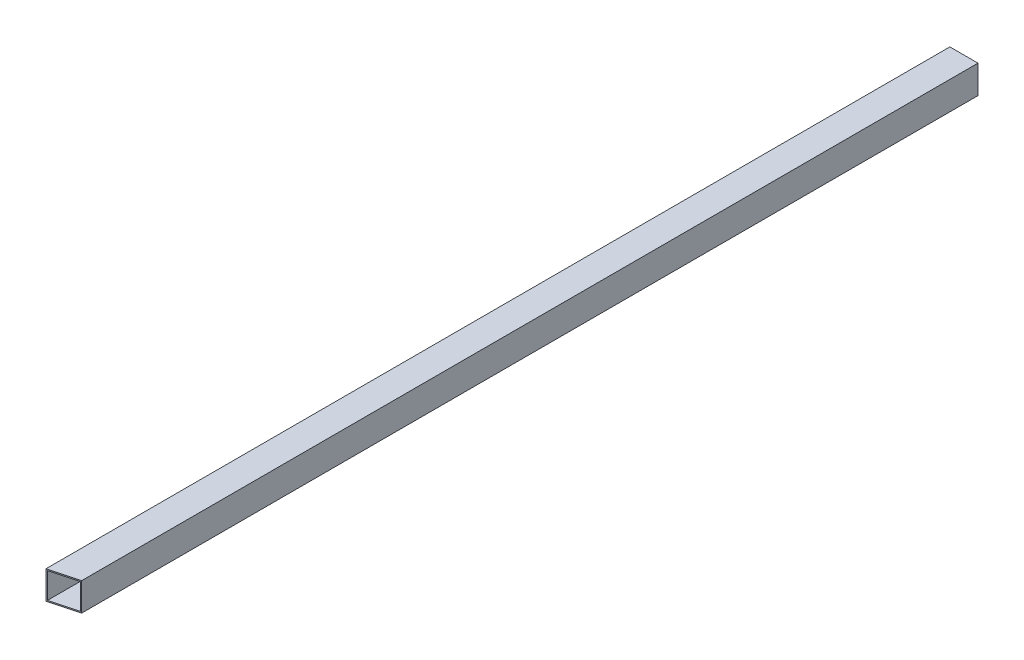
ISO-10303-21;
HEADER;
FILE_DESCRIPTION(('STEP AP214'),'2;1');
FILE_NAME('part.step','',(''),(''),'','','');
FILE_SCHEMA(('AUTOMOTIVE_DESIGN { 1 0 10303 214 1 1 1 1 }'));
ENDSEC;
DATA;
#1=APPLICATION_CONTEXT('core data for automotive mechanical design processes');
#2=APPLICATION_PROTOCOL_DEFINITION('international standard','automotive_design',2000,#1);
#3=PRODUCT_CONTEXT('',#1,'mechanical');
#4=PRODUCT('Part','Part','',(#3));
#5=PRODUCT_RELATED_PRODUCT_CATEGORY('part','',(#4));
#6=PRODUCT_DEFINITION_FORMATION('','',#4);
#7=PRODUCT_DEFINITION_CONTEXT('part definition',#1,'design');
#8=PRODUCT_DEFINITION('design','',#6,#7);
#9=PRODUCT_DEFINITION_SHAPE('','',#8);
#10=(LENGTH_UNIT() NAMED_UNIT(*) SI_UNIT(.MILLI.,.METRE.));
#11=(NAMED_UNIT(*) PLANE_ANGLE_UNIT() SI_UNIT($,.RADIAN.));
#12=(NAMED_UNIT(*) SI_UNIT($,.STERADIAN.) SOLID_ANGLE_UNIT());
#13=UNCERTAINTY_MEASURE_WITH_UNIT(LENGTH_MEASURE(1.E-05),#10,'distance_accuracy_value','');
#14=(GEOMETRIC_REPRESENTATION_CONTEXT(3) GLOBAL_UNCERTAINTY_ASSIGNED_CONTEXT((#13)) GLOBAL_UNIT_ASSIGNED_CONTEXT((#10,
#11,#12)) REPRESENTATION_CONTEXT('',''));
#15=CARTESIAN_POINT('',(0.,0.,0.));
#16=DIRECTION('',(0.,0.,1.));
#17=DIRECTION('',(1.,0.,0.));
#18=AXIS2_PLACEMENT_3D('',#15,#16,#17);
#19=CARTESIAN_POINT('',(-1454.,1675.,10.));
#20=DIRECTION('',(0.,1.,0.));
#21=DIRECTION('',(1.,0.,0.));
#22=AXIS2_PLACEMENT_3D('',#19,#20,#21);
#23=PLANE('',#22);
#24=DIRECTION('',(0.,0.,1.));
#25=VECTOR('',#24,1.);
#26=CARTESIAN_POINT('',(-1454.,1675.,10.));
#27=LINE('',#26,#25);
#28=CARTESIAN_POINT('',(-1454.,1675.,10.));
#29=VERTEX_POINT('',#28);
#30=CARTESIAN_POINT('',(-1454.,1675.,3195.310257359));
#31=VERTEX_POINT('',#30);
#32=EDGE_CURVE('E11',#29,#31,#27,.T.);
#33=ORIENTED_EDGE('',*,*,#32,.F.);
#34=DIRECTION('',(-1.,0.,0.));
#35=VECTOR('',#34,1.);
#36=CARTESIAN_POINT('',(-1454.,1675.,10.));
#37=LINE('',#36,#35);
#38=CARTESIAN_POINT('',(-1546.,1675.,10.));
#39=VERTEX_POINT('',#38);
#40=EDGE_CURVE('E184',#29,#39,#37,.T.);
#41=ORIENTED_EDGE('',*,*,#40,.T.);
#42=DIRECTION('',(0.,0.,1.));
#43=VECTOR('',#42,1.);
#44=CARTESIAN_POINT('',(-1546.,1675.,10.));
#45=LINE('',#44,#43);
#46=CARTESIAN_POINT('',(-1546.,1675.,3219.961583063));
#47=VERTEX_POINT('',#46);
#48=EDGE_CURVE('E142',#39,#47,#45,.T.);
#49=ORIENTED_EDGE('',*,*,#48,.T.);
#50=DIRECTION('',(-0.965925826288944,0.,0.258819045102985));
#51=VECTOR('',#50,1.);
#52=CARTESIAN_POINT('',(-352.776979502,1675.,2900.23843833));
#53=LINE('',#52,#51);
#54=EDGE_CURVE('E158',#31,#47,#53,.T.);
#55=ORIENTED_EDGE('',*,*,#54,.F.);
#56=EDGE_LOOP('',(#33,#41,#49,#55));
#57=FACE_BOUND('',#56,.T.);
#58=ADVANCED_FACE('F17',(#57),#23,.T.);
#59=CARTESIAN_POINT('',(-1454.,1767.,10.));
#60=DIRECTION('',(-1.,0.,0.));
#61=DIRECTION('',(0.,0.,1.));
#62=AXIS2_PLACEMENT_3D('',#59,#60,#61);
#63=PLANE('',#62);
#64=DIRECTION('',(0.,0.,1.));
#65=VECTOR('',#64,1.);
#66=CARTESIAN_POINT('',(-1454.,1767.,10.));
#67=LINE('',#66,#65);
#68=CARTESIAN_POINT('',(-1454.,1767.,10.));
#69=VERTEX_POINT('',#68);
#70=CARTESIAN_POINT('',(-1454.,1767.,3195.310257359));
#71=VERTEX_POINT('',#70);
#72=EDGE_CURVE('E25',#69,#71,#67,.T.);
#73=ORIENTED_EDGE('',*,*,#72,.F.);
#74=DIRECTION('',(0.,-1.,0.));
#75=VECTOR('',#74,1.);
#76=CARTESIAN_POINT('',(-1454.,1767.,10.));
#77=LINE('',#76,#75);
#78=EDGE_CURVE('E143',#69,#29,#77,.T.);
#79=ORIENTED_EDGE('',*,*,#78,.T.);
#80=ORIENTED_EDGE('',*,*,#32,.T.);
#81=DIRECTION('',(0.,-1.,0.));
#82=VECTOR('',#81,1.);
#83=CARTESIAN_POINT('',(-1454.,883.5,3195.310257359));
#84=LINE('',#83,#82);
#85=EDGE_CURVE('E151',#71,#31,#84,.T.);
#86=ORIENTED_EDGE('',*,*,#85,.F.);
#87=EDGE_LOOP('',(#73,#79,#80,#86));
#88=FACE_BOUND('',#87,.T.);
#89=ADVANCED_FACE('F197',(#88),#63,.T.);
#90=CARTESIAN_POINT('',(-1546.,1767.,10.));
#91=DIRECTION('',(0.,-1.,0.));
#92=DIRECTION('',(0.,0.,-1.));
#93=AXIS2_PLACEMENT_3D('',#90,#91,#92);
#94=PLANE('',#93);
#95=DIRECTION('',(0.,0.,1.));
#96=VECTOR('',#95,1.);
#97=CARTESIAN_POINT('',(-1546.,1767.,10.));
#98=LINE('',#97,#96);
#99=CARTESIAN_POINT('',(-1546.,1767.,10.));
#100=VERTEX_POINT('',#99);
#101=CARTESIAN_POINT('',(-1546.,1767.,3219.961583063));
#102=VERTEX_POINT('',#101);
#103=EDGE_CURVE('E177',#100,#102,#98,.T.);
#104=ORIENTED_EDGE('',*,*,#103,.F.);
#105=DIRECTION('',(1.,0.,0.));
#106=VECTOR('',#105,1.);
#107=CARTESIAN_POINT('',(-1546.,1767.,10.));
#108=LINE('',#107,#106);
#109=EDGE_CURVE('E140',#100,#69,#108,.T.);
#110=ORIENTED_EDGE('',*,*,#109,.T.);
#111=ORIENTED_EDGE('',*,*,#72,.T.);
#112=DIRECTION('',(0.965925826288944,0.,-0.258819045102985));
#113=VECTOR('',#112,1.);
#114=CARTESIAN_POINT('',(-395.6955637891,1767.,2911.73843833));
#115=LINE('',#114,#113);
#116=EDGE_CURVE('E147',#102,#71,#115,.T.);
#117=ORIENTED_EDGE('',*,*,#116,.F.);
#118=EDGE_LOOP('',(#104,#110,#111,#117));
#119=FACE_BOUND('',#118,.T.);
#120=ADVANCED_FACE('F194',(#119),#94,.T.);
#121=CARTESIAN_POINT('',(-1546.,1675.,10.));
#122=DIRECTION('',(1.,0.,0.));
#123=DIRECTION('',(0.,1.,0.));
#124=AXIS2_PLACEMENT_3D('',#121,#122,#123);
#125=PLANE('',#124);
#126=ORIENTED_EDGE('',*,*,#48,.F.);
#127=DIRECTION('',(0.,1.,0.));
#128=VECTOR('',#127,1.);
#129=CARTESIAN_POINT('',(-1546.,1675.,10.));
#130=LINE('',#129,#128);
#131=EDGE_CURVE('E180',#39,#100,#130,.T.);
#132=ORIENTED_EDGE('',*,*,#131,.T.);
#133=ORIENTED_EDGE('',*,*,#103,.T.);
#134=DIRECTION('',(0.,1.,0.));
#135=VECTOR('',#134,1.);
#136=CARTESIAN_POINT('',(-1546.,837.5,3219.961583063));
#137=LINE('',#136,#135);
#138=EDGE_CURVE('E162',#47,#102,#137,.T.);
#139=ORIENTED_EDGE('',*,*,#138,.F.);
#140=EDGE_LOOP('',(#126,#132,#133,#139));
#141=FACE_BOUND('',#140,.T.);
#142=ADVANCED_FACE('F203',(#141),#125,.T.);
#143=CARTESIAN_POINT('',(-1450.,1671.,10.));
#144=DIRECTION('',(0.,1.,0.));
#145=DIRECTION('',(1.,0.,0.));
#146=AXIS2_PLACEMENT_3D('',#143,#144,#145);
#147=PLANE('',#146);
#148=DIRECTION('',(-0.965925826288944,0.,0.258819045102985));
#149=VECTOR('',#148,1.);
#150=CARTESIAN_POINT('',(-350.9109540983,1671.,2899.73843833));
#151=LINE('',#150,#149);
#152=CARTESIAN_POINT('',(-1450.,1671.,3194.238460589));
#153=VERTEX_POINT('',#152);
#154=CARTESIAN_POINT('',(-1550.,1671.,3221.033379832));
#155=VERTEX_POINT('',#154);
#156=EDGE_CURVE('E139',#153,#155,#151,.T.);
#157=ORIENTED_EDGE('',*,*,#156,.T.);
#158=DIRECTION('',(0.,0.,1.));
#159=VECTOR('',#158,1.);
#160=CARTESIAN_POINT('',(-1550.,1671.,10.));
#161=LINE('',#160,#159);
#162=CARTESIAN_POINT('',(-1550.,1671.,10.));
#163=VERTEX_POINT('',#162);
#164=EDGE_CURVE('E114',#163,#155,#161,.T.);
#165=ORIENTED_EDGE('',*,*,#164,.F.);
#166=DIRECTION('',(-1.,0.,0.));
#167=VECTOR('',#166,1.);
#168=CARTESIAN_POINT('',(-1450.,1671.,10.));
#169=LINE('',#168,#167);
#170=CARTESIAN_POINT('',(-1450.,1671.,10.));
#171=VERTEX_POINT('',#170);
#172=EDGE_CURVE('E109',#171,#163,#169,.T.);
#173=ORIENTED_EDGE('',*,*,#172,.F.);
#174=DIRECTION('',(0.,0.,1.));
#175=VECTOR('',#174,1.);
#176=CARTESIAN_POINT('',(-1450.,1671.,10.));
#177=LINE('',#176,#175);
#178=EDGE_CURVE('E169',#171,#153,#177,.T.);
#179=ORIENTED_EDGE('',*,*,#178,.T.);
#180=EDGE_LOOP('',(#157,#165,#173,#179));
#181=FACE_BOUND('',#180,.T.);
#182=ADVANCED_FACE('F219',(#181),#147,.F.);
#183=CARTESIAN_POINT('',(-1500.,1721.,10.));
#184=DIRECTION('',(0.,0.,1.));
#185=DIRECTION('',(1.,0.,0.));
#186=AXIS2_PLACEMENT_3D('',#183,#184,#185);
#187=PLANE('',#186);
#188=ORIENTED_EDGE('',*,*,#131,.F.);
#189=ORIENTED_EDGE('',*,*,#40,.F.);
#190=ORIENTED_EDGE('',*,*,#78,.F.);
#191=ORIENTED_EDGE('',*,*,#109,.F.);
#192=EDGE_LOOP('',(#188,#189,#190,#191));
#193=FACE_BOUND('',#192,.T.);
#194=DIRECTION('',(1.,0.,0.));
#195=VECTOR('',#194,1.);
#196=CARTESIAN_POINT('',(-1550.,1771.,10.));
#197=LINE('',#196,#195);
#198=CARTESIAN_POINT('',(-1550.,1771.,10.));
#199=VERTEX_POINT('',#198);
#200=CARTESIAN_POINT('',(-1450.,1771.,10.));
#201=VERTEX_POINT('',#200);
#202=EDGE_CURVE('E107',#199,#201,#197,.T.);
#203=ORIENTED_EDGE('',*,*,#202,.T.);
#204=DIRECTION('',(0.,-1.,0.));
#205=VECTOR('',#204,1.);
#206=CARTESIAN_POINT('',(-1450.,1771.,10.));
#207=LINE('',#206,#205);
#208=EDGE_CURVE('E170',#201,#171,#207,.T.);
#209=ORIENTED_EDGE('',*,*,#208,.T.);
#210=ORIENTED_EDGE('',*,*,#172,.T.);
#211=DIRECTION('',(0.,1.,0.));
#212=VECTOR('',#211,1.);
#213=CARTESIAN_POINT('',(-1550.,1671.,10.));
#214=LINE('',#213,#212);
#215=EDGE_CURVE('E102',#163,#199,#214,.T.);
#216=ORIENTED_EDGE('',*,*,#215,.T.);
#217=EDGE_LOOP('',(#203,#209,#210,#216));
#218=FACE_BOUND('',#217,.T.);
#219=ADVANCED_FACE('F104',(#193,#218),#187,.F.);
#220=CARTESIAN_POINT('',(-1450.,1771.,10.));
#221=DIRECTION('',(-1.,0.,0.));
#222=DIRECTION('',(0.,0.,1.));
#223=AXIS2_PLACEMENT_3D('',#220,#221,#222);
#224=PLANE('',#223);
#225=DIRECTION('',(0.,-1.,0.));
#226=VECTOR('',#225,1.);
#227=CARTESIAN_POINT('',(-1450.,885.5,3194.238460589));
#228=LINE('',#227,#226);
#229=CARTESIAN_POINT('',(-1450.,1771.,3194.238460589));
#230=VERTEX_POINT('',#229);
#231=EDGE_CURVE('E152',#230,#153,#228,.T.);
#232=ORIENTED_EDGE('',*,*,#231,.T.);
#233=ORIENTED_EDGE('',*,*,#178,.F.);
#234=ORIENTED_EDGE('',*,*,#208,.F.);
#235=DIRECTION('',(0.,0.,1.));
#236=VECTOR('',#235,1.);
#237=CARTESIAN_POINT('',(-1450.,1771.,10.));
#238=LINE('',#237,#236);
#239=EDGE_CURVE('E128',#201,#230,#238,.T.);
#240=ORIENTED_EDGE('',*,*,#239,.T.);
#241=EDGE_LOOP('',(#232,#233,#234,#240));
#242=FACE_BOUND('',#241,.T.);
#243=ADVANCED_FACE('F225',(#242),#224,.F.);
#244=CARTESIAN_POINT('',(-47.88152334396,0.,2818.541947077));
#245=DIRECTION('',(-0.258819045102985,0.,-0.965925826288944));
#246=DIRECTION('',(-0.965925826288944,0.,0.258819045102985));
#247=AXIS2_PLACEMENT_3D('',#244,#245,#246);
#248=PLANE('',#247);
#249=ORIENTED_EDGE('',*,*,#116,.T.);
#250=ORIENTED_EDGE('',*,*,#85,.T.);
#251=ORIENTED_EDGE('',*,*,#54,.T.);
#252=ORIENTED_EDGE('',*,*,#138,.T.);
#253=EDGE_LOOP('',(#249,#250,#251,#252));
#254=FACE_BOUND('',#253,.T.);
#255=ORIENTED_EDGE('',*,*,#156,.F.);
#256=ORIENTED_EDGE('',*,*,#231,.F.);
#257=DIRECTION('',(0.965925826288944,0.,-0.258819045102985));
#258=VECTOR('',#257,1.);
#259=CARTESIAN_POINT('',(-397.5615891929,1771.,2912.23843833));
#260=LINE('',#259,#258);
#261=CARTESIAN_POINT('',(-1550.,1771.,3221.033379832));
#262=VERTEX_POINT('',#261);
#263=EDGE_CURVE('E134',#262,#230,#260,.T.);
#264=ORIENTED_EDGE('',*,*,#263,.F.);
#265=DIRECTION('',(0.,1.,0.));
#266=VECTOR('',#265,1.);
#267=CARTESIAN_POINT('',(-1550.,835.5,3221.033379832));
#268=LINE('',#267,#266);
#269=EDGE_CURVE('E115',#155,#262,#268,.T.);
#270=ORIENTED_EDGE('',*,*,#269,.F.);
#271=EDGE_LOOP('',(#255,#256,#264,#270));
#272=FACE_BOUND('',#271,.T.);
#273=ADVANCED_FACE('F199',(#254,#272),#248,.F.);
#274=CARTESIAN_POINT('',(-1550.,1671.,10.));
#275=DIRECTION('',(1.,0.,0.));
#276=DIRECTION('',(0.,1.,0.));
#277=AXIS2_PLACEMENT_3D('',#274,#275,#276);
#278=PLANE('',#277);
#279=ORIENTED_EDGE('',*,*,#269,.T.);
#280=DIRECTION('',(0.,0.,1.));
#281=VECTOR('',#280,1.);
#282=CARTESIAN_POINT('',(-1550.,1771.,10.));
#283=LINE('',#282,#281);
#284=EDGE_CURVE('E118',#199,#262,#283,.T.);
#285=ORIENTED_EDGE('',*,*,#284,.F.);
#286=ORIENTED_EDGE('',*,*,#215,.F.);
#287=ORIENTED_EDGE('',*,*,#164,.T.);
#288=EDGE_LOOP('',(#279,#285,#286,#287));
#289=FACE_BOUND('',#288,.T.);
#290=ADVANCED_FACE('F119',(#289),#278,.F.);
#291=CARTESIAN_POINT('',(-1550.,1771.,10.));
#292=DIRECTION('',(0.,-1.,0.));
#293=DIRECTION('',(0.,0.,-1.));
#294=AXIS2_PLACEMENT_3D('',#291,#292,#293);
#295=PLANE('',#294);
#296=ORIENTED_EDGE('',*,*,#263,.T.);
#297=ORIENTED_EDGE('',*,*,#239,.F.);
#298=ORIENTED_EDGE('',*,*,#202,.F.);
#299=ORIENTED_EDGE('',*,*,#284,.T.);
#300=EDGE_LOOP('',(#296,#297,#298,#299));
#301=FACE_BOUND('',#300,.T.);
#302=ADVANCED_FACE('F126',(#301),#295,.F.);
#303=CLOSED_SHELL('',(#58,#89,#120,#142,#182,#219,#243,#273,#290,#302));
#304=MANIFOLD_SOLID_BREP('B1',#303);
#305=ADVANCED_BREP_SHAPE_REPRESENTATION('',(#18,#304),#14);
#306=SHAPE_DEFINITION_REPRESENTATION(#9,#305);
ENDSEC;
END-ISO-10303-21;
